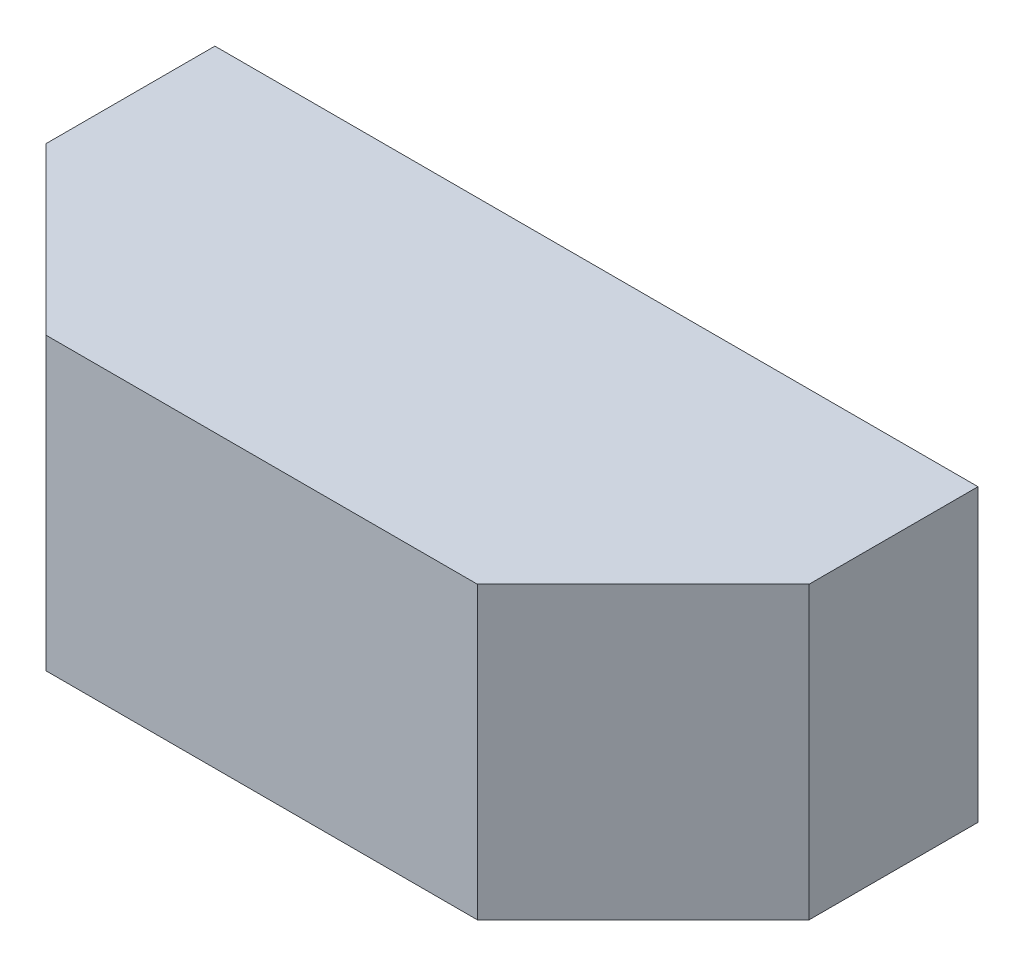
ISO-10303-21;
HEADER;
FILE_DESCRIPTION(('STEP AP214'),'2;1');
FILE_NAME('part.step','',(''),(''),'','','');
FILE_SCHEMA(('AUTOMOTIVE_DESIGN { 1 0 10303 214 1 1 1 1 }'));
ENDSEC;
DATA;
#1=APPLICATION_CONTEXT('core data for automotive mechanical design processes');
#2=APPLICATION_PROTOCOL_DEFINITION('international standard','automotive_design',2000,#1);
#3=PRODUCT_CONTEXT('',#1,'mechanical');
#4=PRODUCT('Part','Part','',(#3));
#5=PRODUCT_RELATED_PRODUCT_CATEGORY('part','',(#4));
#6=PRODUCT_DEFINITION_FORMATION('','',#4);
#7=PRODUCT_DEFINITION_CONTEXT('part definition',#1,'design');
#8=PRODUCT_DEFINITION('design','',#6,#7);
#9=PRODUCT_DEFINITION_SHAPE('','',#8);
#10=(LENGTH_UNIT() NAMED_UNIT(*) SI_UNIT(.MILLI.,.METRE.));
#11=(NAMED_UNIT(*) PLANE_ANGLE_UNIT() SI_UNIT($,.RADIAN.));
#12=(NAMED_UNIT(*) SI_UNIT($,.STERADIAN.) SOLID_ANGLE_UNIT());
#13=UNCERTAINTY_MEASURE_WITH_UNIT(LENGTH_MEASURE(1.E-05),#10,'distance_accuracy_value','');
#14=(GEOMETRIC_REPRESENTATION_CONTEXT(3) GLOBAL_UNCERTAINTY_ASSIGNED_CONTEXT((#13)) GLOBAL_UNIT_ASSIGNED_CONTEXT((#10,
#11,#12)) REPRESENTATION_CONTEXT('',''));
#15=CARTESIAN_POINT('',(0.,0.,0.));
#16=DIRECTION('',(0.,0.,1.));
#17=DIRECTION('',(1.,0.,0.));
#18=AXIS2_PLACEMENT_3D('',#15,#16,#17);
#19=CARTESIAN_POINT('',(26.67,10.16,-5.8));
#20=DIRECTION('',(-1.,0.,0.));
#21=DIRECTION('',(0.,0.,1.));
#22=AXIS2_PLACEMENT_3D('',#19,#20,#21);
#23=PLANE('',#22);
#24=DIRECTION('',(0.,0.,-1.));
#25=VECTOR('',#24,1.);
#26=CARTESIAN_POINT('',(26.67,0.,-5.8));
#27=LINE('',#26,#25);
#28=CARTESIAN_POINT('',(26.67,0.,-5.8));
#29=VERTEX_POINT('',#28);
#30=CARTESIAN_POINT('',(26.67,0.,-11.7));
#31=VERTEX_POINT('',#30);
#32=EDGE_CURVE('E116',#29,#31,#27,.T.);
#33=ORIENTED_EDGE('',*,*,#32,.T.);
#34=DIRECTION('',(0.,-1.,0.));
#35=VECTOR('',#34,1.);
#36=CARTESIAN_POINT('',(26.67,10.16,-11.7));
#37=LINE('',#36,#35);
#38=CARTESIAN_POINT('',(26.67,10.16,-11.7));
#39=VERTEX_POINT('',#38);
#40=EDGE_CURVE('E11',#39,#31,#37,.T.);
#41=ORIENTED_EDGE('',*,*,#40,.F.);
#42=DIRECTION('',(0.,0.,-1.));
#43=VECTOR('',#42,1.);
#44=CARTESIAN_POINT('',(26.67,10.16,-5.8));
#45=LINE('',#44,#43);
#46=CARTESIAN_POINT('',(26.67,10.16,-5.8));
#47=VERTEX_POINT('',#46);
#48=EDGE_CURVE('E126',#47,#39,#45,.T.);
#49=ORIENTED_EDGE('',*,*,#48,.F.);
#50=DIRECTION('',(0.,-1.,0.));
#51=VECTOR('',#50,1.);
#52=CARTESIAN_POINT('',(26.67,10.16,-5.8));
#53=LINE('',#52,#51);
#54=EDGE_CURVE('E112',#47,#29,#53,.T.);
#55=ORIENTED_EDGE('',*,*,#54,.T.);
#56=EDGE_LOOP('',(#33,#41,#49,#55));
#57=FACE_BOUND('',#56,.T.);
#58=ADVANCED_FACE('F32',(#57),#23,.F.);
#59=CARTESIAN_POINT('',(0.,10.16,-11.7));
#60=DIRECTION('',(0.,0.,1.));
#61=DIRECTION('',(1.,0.,0.));
#62=AXIS2_PLACEMENT_3D('',#59,#60,#61);
#63=PLANE('',#62);
#64=DIRECTION('',(-1.,0.,0.));
#65=VECTOR('',#64,1.);
#66=CARTESIAN_POINT('',(0.,0.,-11.7));
#67=LINE('',#66,#65);
#68=CARTESIAN_POINT('',(0.,0.,-11.7));
#69=VERTEX_POINT('',#68);
#70=EDGE_CURVE('E119',#31,#69,#67,.T.);
#71=ORIENTED_EDGE('',*,*,#70,.T.);
#72=DIRECTION('',(0.,-1.,0.));
#73=VECTOR('',#72,1.);
#74=CARTESIAN_POINT('',(0.,10.16,-11.7));
#75=LINE('',#74,#73);
#76=CARTESIAN_POINT('',(0.,10.16,-11.7));
#77=VERTEX_POINT('',#76);
#78=EDGE_CURVE('E40',#77,#69,#75,.T.);
#79=ORIENTED_EDGE('',*,*,#78,.F.);
#80=DIRECTION('',(-1.,0.,0.));
#81=VECTOR('',#80,1.);
#82=CARTESIAN_POINT('',(0.,10.16,-11.7));
#83=LINE('',#82,#81);
#84=EDGE_CURVE('E85',#39,#77,#83,.T.);
#85=ORIENTED_EDGE('',*,*,#84,.F.);
#86=ORIENTED_EDGE('',*,*,#40,.T.);
#87=EDGE_LOOP('',(#71,#79,#85,#86));
#88=FACE_BOUND('',#87,.T.);
#89=ADVANCED_FACE('F150',(#88),#63,.F.);
#90=CARTESIAN_POINT('',(0.,10.16,-5.79655069847577));
#91=DIRECTION('',(1.,0.,0.));
#92=DIRECTION('',(0.,0.,-1.));
#93=AXIS2_PLACEMENT_3D('',#90,#91,#92);
#94=PLANE('',#93);
#95=DIRECTION('',(0.,0.,1.));
#96=VECTOR('',#95,1.);
#97=CARTESIAN_POINT('',(0.,0.,-5.79655069847577));
#98=LINE('',#97,#96);
#99=CARTESIAN_POINT('',(0.,0.,-5.79655069847577));
#100=VERTEX_POINT('',#99);
#101=EDGE_CURVE('E121',#69,#100,#98,.T.);
#102=ORIENTED_EDGE('',*,*,#101,.T.);
#103=DIRECTION('',(0.,-1.,0.));
#104=VECTOR('',#103,1.);
#105=CARTESIAN_POINT('',(0.,10.16,-5.79655069847577));
#106=LINE('',#105,#104);
#107=CARTESIAN_POINT('',(0.,10.16,-5.79655069847577));
#108=VERTEX_POINT('',#107);
#109=EDGE_CURVE('E107',#108,#100,#106,.T.);
#110=ORIENTED_EDGE('',*,*,#109,.F.);
#111=DIRECTION('',(0.,0.,1.));
#112=VECTOR('',#111,1.);
#113=CARTESIAN_POINT('',(0.,10.16,-5.79655069847577));
#114=LINE('',#113,#112);
#115=EDGE_CURVE('E98',#77,#108,#114,.T.);
#116=ORIENTED_EDGE('',*,*,#115,.F.);
#117=ORIENTED_EDGE('',*,*,#78,.T.);
#118=EDGE_LOOP('',(#102,#110,#116,#117));
#119=FACE_BOUND('',#118,.T.);
#120=ADVANCED_FACE('F132',(#119),#94,.F.);
#121=CARTESIAN_POINT('',(5.8,10.16,0.));
#122=DIRECTION('',(0.706896426643387,0.,-0.707317073170732));
#123=DIRECTION('',(-0.707317073170732,0.,-0.706896426643387));
#124=AXIS2_PLACEMENT_3D('',#121,#122,#123);
#125=PLANE('',#124);
#126=DIRECTION('',(0.707317073170732,0.,0.706896426643387));
#127=VECTOR('',#126,1.);
#128=CARTESIAN_POINT('',(5.8,0.,0.));
#129=LINE('',#128,#127);
#130=CARTESIAN_POINT('',(5.8,0.,0.));
#131=VERTEX_POINT('',#130);
#132=EDGE_CURVE('E106',#100,#131,#129,.T.);
#133=ORIENTED_EDGE('',*,*,#132,.T.);
#134=DIRECTION('',(0.,-1.,0.));
#135=VECTOR('',#134,1.);
#136=CARTESIAN_POINT('',(5.8,10.16,0.));
#137=LINE('',#136,#135);
#138=CARTESIAN_POINT('',(5.8,10.16,0.));
#139=VERTEX_POINT('',#138);
#140=EDGE_CURVE('E103',#139,#131,#137,.T.);
#141=ORIENTED_EDGE('',*,*,#140,.F.);
#142=DIRECTION('',(0.707317073170732,0.,0.706896426643387));
#143=VECTOR('',#142,1.);
#144=CARTESIAN_POINT('',(5.8,10.16,0.));
#145=LINE('',#144,#143);
#146=EDGE_CURVE('E92',#108,#139,#145,.T.);
#147=ORIENTED_EDGE('',*,*,#146,.F.);
#148=ORIENTED_EDGE('',*,*,#109,.T.);
#149=EDGE_LOOP('',(#133,#141,#147,#148));
#150=FACE_BOUND('',#149,.T.);
#151=ADVANCED_FACE('F104',(#150),#125,.F.);
#152=CARTESIAN_POINT('',(5.8,10.16,0.));
#153=DIRECTION('',(0.,0.,-1.));
#154=DIRECTION('',(-1.,0.,0.));
#155=AXIS2_PLACEMENT_3D('',#152,#153,#154);
#156=PLANE('',#155);
#157=DIRECTION('',(1.,0.,0.));
#158=VECTOR('',#157,1.);
#159=CARTESIAN_POINT('',(5.8,0.,0.));
#160=LINE('',#159,#158);
#161=CARTESIAN_POINT('',(20.8734493015242,0.,0.));
#162=VERTEX_POINT('',#161);
#163=EDGE_CURVE('E71',#131,#162,#160,.T.);
#164=ORIENTED_EDGE('',*,*,#163,.T.);
#165=DIRECTION('',(0.,-1.,0.));
#166=VECTOR('',#165,1.);
#167=CARTESIAN_POINT('',(20.8734493015242,10.16,0.));
#168=LINE('',#167,#166);
#169=CARTESIAN_POINT('',(20.8734493015242,10.16,0.));
#170=VERTEX_POINT('',#169);
#171=EDGE_CURVE('E108',#170,#162,#168,.T.);
#172=ORIENTED_EDGE('',*,*,#171,.F.);
#173=DIRECTION('',(1.,0.,0.));
#174=VECTOR('',#173,1.);
#175=CARTESIAN_POINT('',(5.8,10.16,0.));
#176=LINE('',#175,#174);
#177=EDGE_CURVE('E96',#139,#170,#176,.T.);
#178=ORIENTED_EDGE('',*,*,#177,.F.);
#179=ORIENTED_EDGE('',*,*,#140,.T.);
#180=EDGE_LOOP('',(#164,#172,#178,#179));
#181=FACE_BOUND('',#180,.T.);
#182=ADVANCED_FACE('F110',(#181),#156,.F.);
#183=CARTESIAN_POINT('',(20.8734493015242,10.16,0.));
#184=DIRECTION('',(-0.707317073170732,0.,-0.706896426643387));
#185=DIRECTION('',(-0.706896426643387,0.,0.707317073170732));
#186=AXIS2_PLACEMENT_3D('',#183,#184,#185);
#187=PLANE('',#186);
#188=DIRECTION('',(0.706896426643387,0.,-0.707317073170732));
#189=VECTOR('',#188,1.);
#190=CARTESIAN_POINT('',(20.8734493015242,0.,0.));
#191=LINE('',#190,#189);
#192=EDGE_CURVE('E77',#162,#29,#191,.T.);
#193=ORIENTED_EDGE('',*,*,#192,.T.);
#194=ORIENTED_EDGE('',*,*,#54,.F.);
#195=DIRECTION('',(0.706896426643387,0.,-0.707317073170732));
#196=VECTOR('',#195,1.);
#197=CARTESIAN_POINT('',(20.8734493015242,10.16,0.));
#198=LINE('',#197,#196);
#199=EDGE_CURVE('E48',#170,#47,#198,.T.);
#200=ORIENTED_EDGE('',*,*,#199,.F.);
#201=ORIENTED_EDGE('',*,*,#171,.T.);
#202=EDGE_LOOP('',(#193,#194,#200,#201));
#203=FACE_BOUND('',#202,.T.);
#204=ADVANCED_FACE('F139',(#203),#187,.F.);
#205=CARTESIAN_POINT('',(0.,10.16,0.));
#206=DIRECTION('',(0.,-1.,0.));
#207=DIRECTION('',(0.,0.,-1.));
#208=AXIS2_PLACEMENT_3D('',#205,#206,#207);
#209=PLANE('',#208);
#210=ORIENTED_EDGE('',*,*,#48,.T.);
#211=ORIENTED_EDGE('',*,*,#84,.T.);
#212=ORIENTED_EDGE('',*,*,#115,.T.);
#213=ORIENTED_EDGE('',*,*,#146,.T.);
#214=ORIENTED_EDGE('',*,*,#177,.T.);
#215=ORIENTED_EDGE('',*,*,#199,.T.);
#216=EDGE_LOOP('',(#210,#211,#212,#213,#214,#215));
#217=FACE_BOUND('',#216,.T.);
#218=ADVANCED_FACE('F94',(#217),#209,.F.);
#219=CARTESIAN_POINT('',(0.,0.,0.));
#220=DIRECTION('',(0.,-1.,0.));
#221=DIRECTION('',(0.,0.,-1.));
#222=AXIS2_PLACEMENT_3D('',#219,#220,#221);
#223=PLANE('',#222);
#224=ORIENTED_EDGE('',*,*,#32,.F.);
#225=ORIENTED_EDGE('',*,*,#192,.F.);
#226=ORIENTED_EDGE('',*,*,#163,.F.);
#227=ORIENTED_EDGE('',*,*,#132,.F.);
#228=ORIENTED_EDGE('',*,*,#101,.F.);
#229=ORIENTED_EDGE('',*,*,#70,.F.);
#230=EDGE_LOOP('',(#224,#225,#226,#227,#228,#229));
#231=FACE_BOUND('',#230,.T.);
#232=ADVANCED_FACE('F135',(#231),#223,.T.);
#233=CLOSED_SHELL('',(#58,#89,#120,#151,#182,#204,#218,#232));
#234=MANIFOLD_SOLID_BREP('B2',#233);
#235=ADVANCED_BREP_SHAPE_REPRESENTATION('',(#18,#234),#14);
#236=SHAPE_DEFINITION_REPRESENTATION(#9,#235);
ENDSEC;
END-ISO-10303-21;
